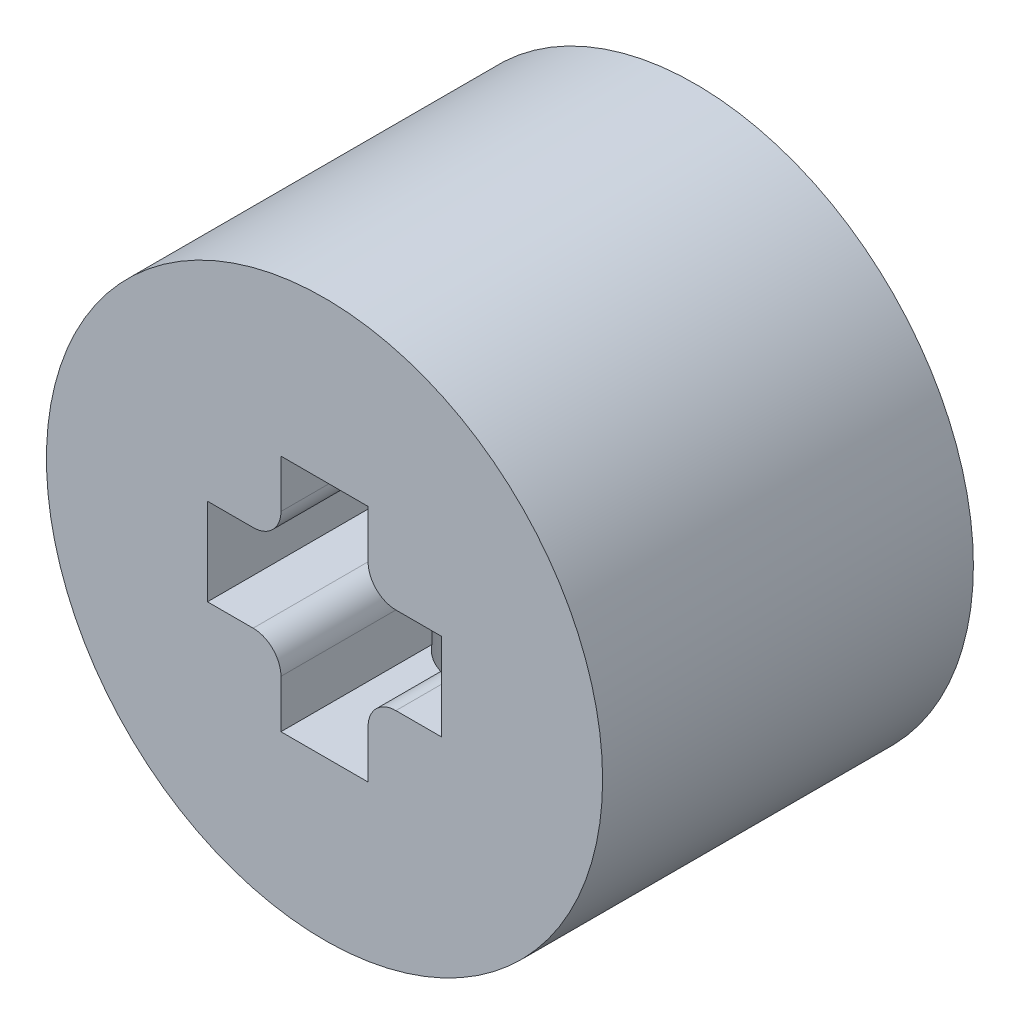
ISO-10303-21;
HEADER;
FILE_DESCRIPTION(('STEP AP214'),'2;1');
FILE_NAME('part.step','',(''),(''),'','','');
FILE_SCHEMA(('AUTOMOTIVE_DESIGN { 1 0 10303 214 1 1 1 1 }'));
ENDSEC;
DATA;
#1=APPLICATION_CONTEXT('core data for automotive mechanical design processes');
#2=APPLICATION_PROTOCOL_DEFINITION('international standard','automotive_design',2000,#1);
#3=PRODUCT_CONTEXT('',#1,'mechanical');
#4=PRODUCT('Part','Part','',(#3));
#5=PRODUCT_RELATED_PRODUCT_CATEGORY('part','',(#4));
#6=PRODUCT_DEFINITION_FORMATION('','',#4);
#7=PRODUCT_DEFINITION_CONTEXT('part definition',#1,'design');
#8=PRODUCT_DEFINITION('design','',#6,#7);
#9=PRODUCT_DEFINITION_SHAPE('','',#8);
#10=(LENGTH_UNIT() NAMED_UNIT(*) SI_UNIT(.MILLI.,.METRE.));
#11=(NAMED_UNIT(*) PLANE_ANGLE_UNIT() SI_UNIT($,.RADIAN.));
#12=(NAMED_UNIT(*) SI_UNIT($,.STERADIAN.) SOLID_ANGLE_UNIT());
#13=UNCERTAINTY_MEASURE_WITH_UNIT(LENGTH_MEASURE(1.E-05),#10,'distance_accuracy_value','');
#14=(GEOMETRIC_REPRESENTATION_CONTEXT(3) GLOBAL_UNCERTAINTY_ASSIGNED_CONTEXT((#13)) GLOBAL_UNIT_ASSIGNED_CONTEXT((#10,
#11,#12)) REPRESENTATION_CONTEXT('',''));
#15=CARTESIAN_POINT('',(0.,0.,0.));
#16=DIRECTION('',(0.,0.,1.));
#17=DIRECTION('',(1.,0.,0.));
#18=AXIS2_PLACEMENT_3D('',#15,#16,#17);
#19=CARTESIAN_POINT('',(0.,0.,8.));
#20=DIRECTION('',(0.,0.,-1.));
#21=DIRECTION('',(-1.,0.,0.));
#22=AXIS2_PLACEMENT_3D('',#19,#20,#21);
#23=CYLINDRICAL_SURFACE('',#22,6.);
#24=CARTESIAN_POINT('',(0.,0.,8.));
#25=DIRECTION('',(0.,0.,1.));
#26=DIRECTION('',(1.,0.,0.));
#27=AXIS2_PLACEMENT_3D('',#24,#25,#26);
#28=CIRCLE('',#27,6.);
#29=CARTESIAN_POINT('',(6.,0.,8.));
#30=VERTEX_POINT('',#29);
#31=EDGE_CURVE('E310',#30,#30,#28,.T.);
#32=ORIENTED_EDGE('',*,*,#31,.F.);
#33=EDGE_LOOP('',(#32));
#34=FACE_BOUND('',#33,.T.);
#35=CARTESIAN_POINT('',(0.,0.,0.));
#36=DIRECTION('',(0.,0.,1.));
#37=DIRECTION('',(1.,0.,0.));
#38=AXIS2_PLACEMENT_3D('',#35,#36,#37);
#39=CIRCLE('',#38,6.);
#40=CARTESIAN_POINT('',(6.,0.,0.));
#41=VERTEX_POINT('',#40);
#42=EDGE_CURVE('E313',#41,#41,#39,.T.);
#43=ORIENTED_EDGE('',*,*,#42,.T.);
#44=EDGE_LOOP('',(#43));
#45=FACE_BOUND('',#44,.T.);
#46=CARTESIAN_POINT('',(0.,-6.,2.8));
#47=CARTESIAN_POINT('',(0.0666922881511598,-5.99999877097045,2.80000245339801));
#48=CARTESIAN_POINT('',(0.133415592241827,-5.99887662213877,2.80557861156118));
#49=CARTESIAN_POINT('',(0.264976209226823,-5.99450838747878,2.82771820013829));
#50=CARTESIAN_POINT('',(0.329811981049627,-5.99126061432223,2.84429035936181));
#51=CARTESIAN_POINT('',(0.455676366315975,-5.98300379133944,2.88788952834495));
#52=CARTESIAN_POINT('',(0.516708561519761,-5.97799642892062,2.91490652421363));
#53=CARTESIAN_POINT('',(0.633369586637071,-5.96676477642377,2.97859869701355));
#54=CARTESIAN_POINT('',(0.688998738090974,-5.96054055882848,3.01527329872865));
#55=CARTESIAN_POINT('',(0.794032172777838,-5.94746598395964,3.09776619314972));
#56=CARTESIAN_POINT('',(0.843352741390229,-5.94060894605217,3.14369002646944));
#57=CARTESIAN_POINT('',(0.933644107929634,-5.92709016543106,3.24315089967004));
#58=CARTESIAN_POINT('',(0.974614253724509,-5.92042843800509,3.29668853360214));
#59=CARTESIAN_POINT('',(1.04739810401714,-5.90798930175138,3.41045943161425));
#60=CARTESIAN_POINT('',(1.07912512663904,-5.90222048837935,3.47074917255563));
#61=CARTESIAN_POINT('',(1.13196679989637,-5.89231521670101,3.59593818280489));
#62=CARTESIAN_POINT('',(1.15308249892469,-5.88817859714354,3.66083699601561));
#63=CARTESIAN_POINT('',(1.18383035986179,-5.88207366302646,3.7925012366895));
#64=CARTESIAN_POINT('',(1.19360939755053,-5.88007764128625,3.85923105297067));
#65=CARTESIAN_POINT('',(1.20186255327134,-5.87839650072753,3.99341178563721));
#66=CARTESIAN_POINT('',(1.2003378272562,-5.87871114561409,4.06086262758417));
#67=CARTESIAN_POINT('',(1.18614548772218,-5.88159061377822,4.1934961456252));
#68=CARTESIAN_POINT('',(1.17364624829269,-5.88412143430516,4.25869768675278));
#69=CARTESIAN_POINT('',(1.13812546154766,-5.89109455392002,4.3860592919956));
#70=CARTESIAN_POINT('',(1.11510341172082,-5.89553694429335,4.44821921070281));
#71=CARTESIAN_POINT('',(1.05902974040966,-5.9058674220049,4.56821831404432));
#72=CARTESIAN_POINT('',(1.02591138147854,-5.91176507776446,4.62602545548301));
#73=CARTESIAN_POINT('',(0.950632289487216,-5.92433542527674,4.73532501996738));
#74=CARTESIAN_POINT('',(0.908470517228195,-5.93100820606039,4.78681671622139));
#75=CARTESIAN_POINT('',(0.815399921472702,-5.94452425489754,4.88299528294832));
#76=CARTESIAN_POINT('',(0.764347393454934,-5.95136843053086,4.92754308143096));
#77=CARTESIAN_POINT('',(0.655422028874412,-5.9643461845729,5.00746461556147));
#78=CARTESIAN_POINT('',(0.597549104855267,-5.97047975386768,5.04283823355229));
#79=CARTESIAN_POINT('',(0.476471264254705,-5.98136028193065,5.10343301107117));
#80=CARTESIAN_POINT('',(0.41325818350236,-5.98610506617926,5.12863827237344));
#81=CARTESIAN_POINT('',(0.283378771738398,-5.9936569078543,5.16803256884628));
#82=CARTESIAN_POINT('',(0.21671286008694,-5.99646420000638,5.18222293848835));
#83=CARTESIAN_POINT('',(0.0830152867525815,-5.99979206240241,5.19898774455313));
#84=CARTESIAN_POINT('',(0.0160083939906924,-6.00035009582964,5.20175250344832));
#85=CARTESIAN_POINT('',(-0.117509921031256,-5.99922062316123,5.19610016926938));
#86=CARTESIAN_POINT('',(-0.184021370932551,-5.99753324329735,5.18768370477688));
#87=CARTESIAN_POINT('',(-0.314046791935848,-5.99212598409621,5.16006595174725));
#88=CARTESIAN_POINT('',(-0.377582338007883,-5.98842451685048,5.14096231780252));
#89=CARTESIAN_POINT('',(-0.5005483529996,-5.97940262473239,5.09261922081303));
#90=CARTESIAN_POINT('',(-0.559978513965047,-5.97408207857072,5.0633789983878));
#91=CARTESIAN_POINT('',(-0.67384940842346,-5.96231893839953,4.99518101121842));
#92=CARTESIAN_POINT('',(-0.728220152102624,-5.95586340524462,4.95610866275327));
#93=CARTESIAN_POINT('',(-0.829701622943047,-5.94257681795859,4.86950897055126));
#94=CARTESIAN_POINT('',(-0.876811570716914,-5.93574572362066,4.82198072032016));
#95=CARTESIAN_POINT('',(-0.963168708929011,-5.92235164268358,4.71895197773065));
#96=CARTESIAN_POINT('',(-1.00228524293839,-5.91579432279965,4.6633411069344));
#97=CARTESIAN_POINT('',(-1.07062250406145,-5.90381030155433,4.54622636637199));
#98=CARTESIAN_POINT('',(-1.09984362710748,-5.89838355496011,4.48472273251174));
#99=CARTESIAN_POINT('',(-1.14738220989835,-5.8893208870126,4.35787810462054));
#100=CARTESIAN_POINT('',(-1.16575619974926,-5.88567569846624,4.29255899054762));
#101=CARTESIAN_POINT('',(-1.19125038195263,-5.8805692415043,4.15967985581092));
#102=CARTESIAN_POINT('',(-1.19837204187013,-5.87910768829334,4.09212012854878));
#103=CARTESIAN_POINT('',(-1.20110509304096,-5.87854979557655,3.95798936254682));
#104=CARTESIAN_POINT('',(-1.19692294568507,-5.87941103027161,3.89142262128759));
#105=CARTESIAN_POINT('',(-1.17762276492007,-5.88330688181537,3.75996202011397));
#106=CARTESIAN_POINT('',(-1.16250481935516,-5.88634148120603,3.69506814676623));
#107=CARTESIAN_POINT('',(-1.12185428219874,-5.8942231706299,3.56892674651135));
#108=CARTESIAN_POINT('',(-1.09634700806081,-5.89906585222597,3.5076707673971));
#109=CARTESIAN_POINT('',(-1.03566557352193,-5.91002057969004,3.39027553511867));
#110=CARTESIAN_POINT('',(-1.00049060252986,-5.91613273198673,3.33413671152984));
#111=CARTESIAN_POINT('',(-0.920767097743697,-5.9290675262787,3.22754131341962));
#112=CARTESIAN_POINT('',(-0.876069464682216,-5.9359004749164,3.17719748167889));
#113=CARTESIAN_POINT('',(-0.778877242815769,-5.94943298246346,3.084656553365));
#114=CARTESIAN_POINT('',(-0.726380864584002,-5.95613251035821,3.04246133161927));
#115=CARTESIAN_POINT('',(-0.614421154905895,-5.96872598865566,2.96699842726426));
#116=CARTESIAN_POINT('',(-0.554890661315801,-5.97461077463096,2.93382879606397));
#117=CARTESIAN_POINT('',(-0.430999633128879,-5.98482150102,2.87801665288409));
#118=CARTESIAN_POINT('',(-0.366643513035751,-5.98914884566339,2.85536465256101));
#119=CARTESIAN_POINT('',(-0.251785786708535,-5.99491647114445,2.82561766234634));
#120=CARTESIAN_POINT('',(-0.201937996816541,-5.99681163790142,2.81602816755069));
#121=CARTESIAN_POINT('',(-0.10139943025208,-5.99935384967871,2.80321850516996));
#122=CARTESIAN_POINT('',(-0.0507086804983428,-6.00000093447786,2.79999813458828));
#123=CARTESIAN_POINT('',(0.,-6.,2.8));
#124=B_SPLINE_CURVE_WITH_KNOTS('',3,(#46,#47,#48,#49,#50,#51,#52,#53,#54,#55,#56,#57,#58,#59,
#60,#61,#62,#63,#64,#65,#66,#67,#68,#69,#70,#71,#72,#73,#74,#75,#76,#77,#78,#79,#80,#81,#82,#83,
#84,#85,#86,#87,#88,#89,#90,#91,#92,#93,#94,#95,#96,#97,#98,#99,#100,#101,#102,#103,#104,#105,
#106,#107,#108,#109,#110,#111,#112,#113,#114,#115,#116,#117,#118,#119,#120,#121,#122,#123),
.UNSPECIFIED.,.T.,.F.,(4,2,2,2,2,2,2,2,2,2,2,2,2,2,2,2,2,2,2,2,2,2,2,2,2,2,2,2,2,2,2,2,2,2,2,2,
2,2,4),(0.,0.19989135679351,0.399941580829587,0.59980048230041,0.799647482677035,
1.00191920413462,1.20420671609684,1.40833434007107,1.61244179238237,1.81387422124305,
2.0152860513747,2.21366072407534,2.41204487104476,2.61176988244311,2.81151785699605,
3.01485902989621,3.21820281047784,3.42186329824829,3.62549910837643,3.82572882811518,
4.02594729189441,4.22436544740868,4.42279847059227,4.6236607924003,4.82454466015116,
5.02848754295071,5.2324222646816,5.43528457239268,5.63812041996498,5.83727667081242,
6.0364313219113,6.23510353503732,6.4337924109824,6.63585691486972,6.83796785439517,
7.04219396010765,7.24623546621022,7.39822530347873,7.55021029645196),.UNSPECIFIED.);
#125=CARTESIAN_POINT('',(0.,-6.,2.8));
#126=VERTEX_POINT('',#125);
#127=EDGE_CURVE('E236',#126,#126,#124,.T.);
#128=ORIENTED_EDGE('',*,*,#127,.F.);
#129=EDGE_LOOP('',(#128));
#130=FACE_BOUND('',#129,.T.);
#131=ADVANCED_FACE('F69',(#34,#45,#130),#23,.T.);
#132=CARTESIAN_POINT('',(0.939999999999999,2.575,0.));
#133=DIRECTION('',(-1.,0.,0.));
#134=DIRECTION('',(0.,-1.,0.));
#135=AXIS2_PLACEMENT_3D('',#132,#133,#134);
#136=PLANE('',#135);
#137=DIRECTION('',(0.,0.,1.));
#138=VECTOR('',#137,1.);
#139=CARTESIAN_POINT('',(0.94,-2.575,0.));
#140=LINE('',#139,#138);
#141=CARTESIAN_POINT('',(0.94,-2.575,0.));
#142=VERTEX_POINT('',#141);
#143=CARTESIAN_POINT('',(0.94,-2.575,3.25407775204114));
#144=VERTEX_POINT('',#143);
#145=EDGE_CURVE('E403',#142,#144,#140,.T.);
#146=ORIENTED_EDGE('',*,*,#145,.T.);
#147=DIRECTION('',(0.,-1.,0.));
#148=VECTOR('',#147,1.);
#149=CARTESIAN_POINT('',(0.94,-2.075,3.25407775204114));
#150=LINE('',#149,#148);
#151=CARTESIAN_POINT('',(0.94,-2.075,3.25407775204114));
#152=VERTEX_POINT('',#151);
#153=EDGE_CURVE('E228',#144,#152,#150,.F.);
#154=ORIENTED_EDGE('',*,*,#153,.T.);
#155=DIRECTION('',(0.,0.,-1.));
#156=VECTOR('',#155,1.);
#157=CARTESIAN_POINT('',(0.94,-2.075,0.));
#158=LINE('',#157,#156);
#159=CARTESIAN_POINT('',(0.94,-2.075,4.74592224795886));
#160=VERTEX_POINT('',#159);
#161=EDGE_CURVE('E223',#160,#152,#158,.T.);
#162=ORIENTED_EDGE('',*,*,#161,.F.);
#163=DIRECTION('',(0.,-1.,0.));
#164=VECTOR('',#163,1.);
#165=CARTESIAN_POINT('',(0.94,-2.075,4.74592224795886));
#166=LINE('',#165,#164);
#167=CARTESIAN_POINT('',(0.94,-2.575,4.74592224795886));
#168=VERTEX_POINT('',#167);
#169=EDGE_CURVE('E207',#160,#168,#166,.T.);
#170=ORIENTED_EDGE('',*,*,#169,.T.);
#171=CARTESIAN_POINT('',(0.94,-2.575,8.));
#172=VERTEX_POINT('',#171);
#173=EDGE_CURVE('E386',#168,#172,#140,.T.);
#174=ORIENTED_EDGE('',*,*,#173,.T.);
#175=DIRECTION('',(0.,-1.,0.));
#176=VECTOR('',#175,1.);
#177=CARTESIAN_POINT('',(0.939999999999999,2.575,8.));
#178=LINE('',#177,#176);
#179=CARTESIAN_POINT('',(0.94,-1.54,8.));
#180=VERTEX_POINT('',#179);
#181=EDGE_CURVE('E463',#180,#172,#178,.T.);
#182=ORIENTED_EDGE('',*,*,#181,.F.);
#183=DIRECTION('',(0.,0.,-1.));
#184=VECTOR('',#183,1.);
#185=CARTESIAN_POINT('',(0.94,-1.54,0.));
#186=LINE('',#185,#184);
#187=CARTESIAN_POINT('',(0.94,-1.54,0.));
#188=VERTEX_POINT('',#187);
#189=EDGE_CURVE('E363',#180,#188,#186,.T.);
#190=ORIENTED_EDGE('',*,*,#189,.T.);
#191=DIRECTION('',(0.,-1.,0.));
#192=VECTOR('',#191,1.);
#193=CARTESIAN_POINT('',(0.939999999999999,2.575,0.));
#194=LINE('',#193,#192);
#195=EDGE_CURVE('E448',#188,#142,#194,.T.);
#196=ORIENTED_EDGE('',*,*,#195,.T.);
#197=EDGE_LOOP('',(#146,#154,#162,#170,#174,#182,#190,#196));
#198=FACE_BOUND('',#197,.T.);
#199=ADVANCED_FACE('F227',(#198),#136,.T.);
#200=CARTESIAN_POINT('',(-0.94,-2.575,0.));
#201=DIRECTION('',(0.,-1.,0.));
#202=DIRECTION('',(0.,0.,-1.));
#203=AXIS2_PLACEMENT_3D('',#200,#201,#202);
#204=PLANE('',#203);
#205=CARTESIAN_POINT('',(0.,-2.575,4.));
#206=DIRECTION('',(0.,-1.,0.));
#207=DIRECTION('',(0.,0.,-1.));
#208=AXIS2_PLACEMENT_3D('',#205,#206,#207);
#209=CIRCLE('',#208,1.2);
#210=CARTESIAN_POINT('',(-0.94,-2.575,4.74592224795886));
#211=VERTEX_POINT('',#210);
#212=EDGE_CURVE('E214',#211,#168,#209,.F.);
#213=ORIENTED_EDGE('',*,*,#212,.F.);
#214=DIRECTION('',(0.,0.,1.));
#215=VECTOR('',#214,1.);
#216=CARTESIAN_POINT('',(-0.94,-2.575,0.));
#217=LINE('',#216,#215);
#218=CARTESIAN_POINT('',(-0.94,-2.575,8.));
#219=VERTEX_POINT('',#218);
#220=EDGE_CURVE('E384',#211,#219,#217,.T.);
#221=ORIENTED_EDGE('',*,*,#220,.T.);
#222=DIRECTION('',(1.,0.,0.));
#223=VECTOR('',#222,1.);
#224=CARTESIAN_POINT('',(-0.94,-2.575,8.));
#225=LINE('',#224,#223);
#226=EDGE_CURVE('E467',#219,#172,#225,.T.);
#227=ORIENTED_EDGE('',*,*,#226,.T.);
#228=ORIENTED_EDGE('',*,*,#173,.F.);
#229=EDGE_LOOP('',(#213,#221,#227,#228));
#230=FACE_BOUND('',#229,.T.);
#231=ADVANCED_FACE('F279',(#230),#204,.F.);
#232=CARTESIAN_POINT('',(-0.940000000000001,2.575,0.));
#233=DIRECTION('',(-1.,0.,0.));
#234=DIRECTION('',(0.,-1.,0.));
#235=AXIS2_PLACEMENT_3D('',#232,#233,#234);
#236=PLANE('',#235);
#237=DIRECTION('',(0.,-1.,0.));
#238=VECTOR('',#237,1.);
#239=CARTESIAN_POINT('',(-0.94,-2.075,3.25407775204114));
#240=LINE('',#239,#238);
#241=CARTESIAN_POINT('',(-0.94,-2.575,3.25407775204114));
#242=VERTEX_POINT('',#241);
#243=CARTESIAN_POINT('',(-0.94,-2.075,3.25407775204114));
#244=VERTEX_POINT('',#243);
#245=EDGE_CURVE('E12',#242,#244,#240,.F.);
#246=ORIENTED_EDGE('',*,*,#245,.F.);
#247=CARTESIAN_POINT('',(-0.94,-2.575,0.));
#248=VERTEX_POINT('',#247);
#249=EDGE_CURVE('E392',#248,#242,#217,.T.);
#250=ORIENTED_EDGE('',*,*,#249,.F.);
#251=DIRECTION('',(0.,-1.,0.));
#252=VECTOR('',#251,1.);
#253=CARTESIAN_POINT('',(-0.940000000000001,2.575,0.));
#254=LINE('',#253,#252);
#255=CARTESIAN_POINT('',(-0.94,-1.54,0.));
#256=VERTEX_POINT('',#255);
#257=EDGE_CURVE('E457',#256,#248,#254,.T.);
#258=ORIENTED_EDGE('',*,*,#257,.F.);
#259=DIRECTION('',(0.,0.,-1.));
#260=VECTOR('',#259,1.);
#261=CARTESIAN_POINT('',(-0.94,-1.54,0.));
#262=LINE('',#261,#260);
#263=CARTESIAN_POINT('',(-0.94,-1.54,8.));
#264=VERTEX_POINT('',#263);
#265=EDGE_CURVE('E360',#256,#264,#262,.F.);
#266=ORIENTED_EDGE('',*,*,#265,.T.);
#267=DIRECTION('',(0.,-1.,0.));
#268=VECTOR('',#267,1.);
#269=CARTESIAN_POINT('',(-0.940000000000001,2.575,8.));
#270=LINE('',#269,#268);
#271=EDGE_CURVE('E389',#264,#219,#270,.T.);
#272=ORIENTED_EDGE('',*,*,#271,.T.);
#273=ORIENTED_EDGE('',*,*,#220,.F.);
#274=DIRECTION('',(0.,-1.,0.));
#275=VECTOR('',#274,1.);
#276=CARTESIAN_POINT('',(-0.94,-2.075,4.74592224795886));
#277=LINE('',#276,#275);
#278=CARTESIAN_POINT('',(-0.94,-2.075,4.74592224795886));
#279=VERTEX_POINT('',#278);
#280=EDGE_CURVE('E78',#279,#211,#277,.T.);
#281=ORIENTED_EDGE('',*,*,#280,.F.);
#282=DIRECTION('',(0.,0.,-1.));
#283=VECTOR('',#282,1.);
#284=CARTESIAN_POINT('',(-0.94,-2.075,0.));
#285=LINE('',#284,#283);
#286=EDGE_CURVE('E376',#279,#244,#285,.T.);
#287=ORIENTED_EDGE('',*,*,#286,.T.);
#288=EDGE_LOOP('',(#246,#250,#258,#266,#272,#273,#281,#287));
#289=FACE_BOUND('',#288,.T.);
#290=ADVANCED_FACE('F275',(#289),#236,.F.);
#291=CARTESIAN_POINT('',(0.,0.,8.));
#292=DIRECTION('',(0.,0.,1.));
#293=DIRECTION('',(1.,0.,0.));
#294=AXIS2_PLACEMENT_3D('',#291,#292,#293);
#295=PLANE('',#294);
#296=ORIENTED_EDGE('',*,*,#31,.T.);
#297=EDGE_LOOP('',(#296));
#298=FACE_BOUND('',#297,.T.);
#299=DIRECTION('',(1.,0.,0.));
#300=VECTOR('',#299,1.);
#301=CARTESIAN_POINT('',(-2.525,0.94,8.));
#302=LINE('',#301,#300);
#303=CARTESIAN_POINT('',(-2.525,0.94,8.));
#304=VERTEX_POINT('',#303);
#305=CARTESIAN_POINT('',(-1.54,0.94,8.));
#306=VERTEX_POINT('',#305);
#307=EDGE_CURVE('E431',#304,#306,#302,.T.);
#308=ORIENTED_EDGE('',*,*,#307,.T.);
#309=CARTESIAN_POINT('',(-1.54,1.54,8.));
#310=DIRECTION('',(0.,0.,1.));
#311=DIRECTION('',(1.,0.,0.));
#312=AXIS2_PLACEMENT_3D('',#309,#310,#311);
#313=CIRCLE('',#312,0.6);
#314=CARTESIAN_POINT('',(-0.94,1.54,8.));
#315=VERTEX_POINT('',#314);
#316=EDGE_CURVE('E353',#306,#315,#313,.T.);
#317=ORIENTED_EDGE('',*,*,#316,.T.);
#318=CARTESIAN_POINT('',(-0.940000000000001,2.575,8.));
#319=VERTEX_POINT('',#318);
#320=EDGE_CURVE('E449',#319,#315,#270,.T.);
#321=ORIENTED_EDGE('',*,*,#320,.F.);
#322=DIRECTION('',(1.,0.,0.));
#323=VECTOR('',#322,1.);
#324=CARTESIAN_POINT('',(-0.940000000000001,2.575,8.));
#325=LINE('',#324,#323);
#326=CARTESIAN_POINT('',(0.939999999999999,2.575,8.));
#327=VERTEX_POINT('',#326);
#328=EDGE_CURVE('E245',#319,#327,#325,.T.);
#329=ORIENTED_EDGE('',*,*,#328,.T.);
#330=CARTESIAN_POINT('',(0.94,1.54,8.));
#331=VERTEX_POINT('',#330);
#332=EDGE_CURVE('E464',#327,#331,#178,.T.);
#333=ORIENTED_EDGE('',*,*,#332,.T.);
#334=CARTESIAN_POINT('',(1.54,1.54,8.));
#335=DIRECTION('',(0.,0.,1.));
#336=DIRECTION('',(1.,0.,0.));
#337=AXIS2_PLACEMENT_3D('',#334,#335,#336);
#338=CIRCLE('',#337,0.6);
#339=CARTESIAN_POINT('',(1.54,0.94,8.));
#340=VERTEX_POINT('',#339);
#341=EDGE_CURVE('E344',#331,#340,#338,.T.);
#342=ORIENTED_EDGE('',*,*,#341,.T.);
#343=CARTESIAN_POINT('',(2.525,0.94,8.));
#344=VERTEX_POINT('',#343);
#345=EDGE_CURVE('E430',#340,#344,#302,.T.);
#346=ORIENTED_EDGE('',*,*,#345,.T.);
#347=DIRECTION('',(0.,-1.,0.));
#348=VECTOR('',#347,1.);
#349=CARTESIAN_POINT('',(2.525,0.94,8.));
#350=LINE('',#349,#348);
#351=CARTESIAN_POINT('',(2.525,-0.94,8.));
#352=VERTEX_POINT('',#351);
#353=EDGE_CURVE('E426',#344,#352,#350,.T.);
#354=ORIENTED_EDGE('',*,*,#353,.T.);
#355=DIRECTION('',(1.,0.,0.));
#356=VECTOR('',#355,1.);
#357=CARTESIAN_POINT('',(-2.525,-0.94,8.));
#358=LINE('',#357,#356);
#359=CARTESIAN_POINT('',(1.54,-0.94,8.));
#360=VERTEX_POINT('',#359);
#361=EDGE_CURVE('E413',#360,#352,#358,.T.);
#362=ORIENTED_EDGE('',*,*,#361,.F.);
#363=CARTESIAN_POINT('',(1.54,-1.54,8.));
#364=DIRECTION('',(0.,0.,1.));
#365=DIRECTION('',(1.,0.,0.));
#366=AXIS2_PLACEMENT_3D('',#363,#364,#365);
#367=CIRCLE('',#366,0.6);
#368=EDGE_CURVE('E347',#360,#180,#367,.T.);
#369=ORIENTED_EDGE('',*,*,#368,.T.);
#370=ORIENTED_EDGE('',*,*,#181,.T.);
#371=ORIENTED_EDGE('',*,*,#226,.F.);
#372=ORIENTED_EDGE('',*,*,#271,.F.);
#373=CARTESIAN_POINT('',(-1.54,-1.54,8.));
#374=DIRECTION('',(0.,0.,1.));
#375=DIRECTION('',(1.,0.,0.));
#376=AXIS2_PLACEMENT_3D('',#373,#374,#375);
#377=CIRCLE('',#376,0.6);
#378=CARTESIAN_POINT('',(-1.54,-0.94,8.));
#379=VERTEX_POINT('',#378);
#380=EDGE_CURVE('E350',#264,#379,#377,.T.);
#381=ORIENTED_EDGE('',*,*,#380,.T.);
#382=CARTESIAN_POINT('',(-2.525,-0.94,8.));
#383=VERTEX_POINT('',#382);
#384=EDGE_CURVE('E418',#383,#379,#358,.T.);
#385=ORIENTED_EDGE('',*,*,#384,.F.);
#386=DIRECTION('',(0.,-1.,0.));
#387=VECTOR('',#386,1.);
#388=CARTESIAN_POINT('',(-2.525,0.94,8.));
#389=LINE('',#388,#387);
#390=EDGE_CURVE('E408',#304,#383,#389,.T.);
#391=ORIENTED_EDGE('',*,*,#390,.F.);
#392=EDGE_LOOP('',(#308,#317,#321,#329,#333,#342,#346,#354,#362,#369,#370,#371,#372,#381,#385,#391));
#393=FACE_BOUND('',#392,.T.);
#394=ADVANCED_FACE('F278',(#298,#393),#295,.T.);
#395=CARTESIAN_POINT('',(0.,0.,0.));
#396=DIRECTION('',(0.,0.,1.));
#397=DIRECTION('',(1.,0.,0.));
#398=AXIS2_PLACEMENT_3D('',#395,#396,#397);
#399=PLANE('',#398);
#400=ORIENTED_EDGE('',*,*,#42,.F.);
#401=EDGE_LOOP('',(#400));
#402=FACE_BOUND('',#401,.T.);
#403=CARTESIAN_POINT('',(-0.940000000000001,2.575,0.));
#404=VERTEX_POINT('',#403);
#405=CARTESIAN_POINT('',(-0.94,1.54,0.));
#406=VERTEX_POINT('',#405);
#407=EDGE_CURVE('E399',#404,#406,#254,.T.);
#408=ORIENTED_EDGE('',*,*,#407,.T.);
#409=CARTESIAN_POINT('',(-1.54,1.54,0.));
#410=DIRECTION('',(0.,0.,1.));
#411=DIRECTION('',(1.,0.,0.));
#412=AXIS2_PLACEMENT_3D('',#409,#410,#411);
#413=CIRCLE('',#412,0.6);
#414=CARTESIAN_POINT('',(-1.54,0.94,0.));
#415=VERTEX_POINT('',#414);
#416=EDGE_CURVE('E338',#406,#415,#413,.F.);
#417=ORIENTED_EDGE('',*,*,#416,.T.);
#418=DIRECTION('',(1.,0.,0.));
#419=VECTOR('',#418,1.);
#420=CARTESIAN_POINT('',(-2.525,0.94,0.));
#421=LINE('',#420,#419);
#422=CARTESIAN_POINT('',(-2.525,0.94,0.));
#423=VERTEX_POINT('',#422);
#424=EDGE_CURVE('E421',#423,#415,#421,.T.);
#425=ORIENTED_EDGE('',*,*,#424,.F.);
#426=DIRECTION('',(0.,-1.,0.));
#427=VECTOR('',#426,1.);
#428=CARTESIAN_POINT('',(-2.525,0.94,0.));
#429=LINE('',#428,#427);
#430=CARTESIAN_POINT('',(-2.525,-0.94,0.));
#431=VERTEX_POINT('',#430);
#432=EDGE_CURVE('E246',#423,#431,#429,.T.);
#433=ORIENTED_EDGE('',*,*,#432,.T.);
#434=DIRECTION('',(1.,0.,0.));
#435=VECTOR('',#434,1.);
#436=CARTESIAN_POINT('',(-2.525,-0.94,0.));
#437=LINE('',#436,#435);
#438=CARTESIAN_POINT('',(-1.54,-0.94,0.));
#439=VERTEX_POINT('',#438);
#440=EDGE_CURVE('E502',#431,#439,#437,.T.);
#441=ORIENTED_EDGE('',*,*,#440,.T.);
#442=CARTESIAN_POINT('',(-1.54,-1.54,0.));
#443=DIRECTION('',(0.,0.,1.));
#444=DIRECTION('',(1.,0.,0.));
#445=AXIS2_PLACEMENT_3D('',#442,#443,#444);
#446=CIRCLE('',#445,0.6);
#447=EDGE_CURVE('E335',#439,#256,#446,.F.);
#448=ORIENTED_EDGE('',*,*,#447,.T.);
#449=ORIENTED_EDGE('',*,*,#257,.T.);
#450=DIRECTION('',(1.,0.,0.));
#451=VECTOR('',#450,1.);
#452=CARTESIAN_POINT('',(-0.94,-2.575,0.));
#453=LINE('',#452,#451);
#454=EDGE_CURVE('E453',#248,#142,#453,.T.);
#455=ORIENTED_EDGE('',*,*,#454,.T.);
#456=ORIENTED_EDGE('',*,*,#195,.F.);
#457=CARTESIAN_POINT('',(1.54,-1.54,0.));
#458=DIRECTION('',(0.,0.,1.));
#459=DIRECTION('',(1.,0.,0.));
#460=AXIS2_PLACEMENT_3D('',#457,#458,#459);
#461=CIRCLE('',#460,0.6);
#462=CARTESIAN_POINT('',(1.54,-0.94,0.));
#463=VERTEX_POINT('',#462);
#464=EDGE_CURVE('E332',#188,#463,#461,.F.);
#465=ORIENTED_EDGE('',*,*,#464,.T.);
#466=CARTESIAN_POINT('',(2.525,-0.94,0.));
#467=VERTEX_POINT('',#466);
#468=EDGE_CURVE('E496',#463,#467,#437,.T.);
#469=ORIENTED_EDGE('',*,*,#468,.T.);
#470=DIRECTION('',(0.,-1.,0.));
#471=VECTOR('',#470,1.);
#472=CARTESIAN_POINT('',(2.525,0.94,0.));
#473=LINE('',#472,#471);
#474=CARTESIAN_POINT('',(2.525,0.94,0.));
#475=VERTEX_POINT('',#474);
#476=EDGE_CURVE('E505',#475,#467,#473,.T.);
#477=ORIENTED_EDGE('',*,*,#476,.F.);
#478=CARTESIAN_POINT('',(1.54,0.94,0.));
#479=VERTEX_POINT('',#478);
#480=EDGE_CURVE('E508',#479,#475,#421,.T.);
#481=ORIENTED_EDGE('',*,*,#480,.F.);
#482=CARTESIAN_POINT('',(1.54,1.54,0.));
#483=DIRECTION('',(0.,0.,1.));
#484=DIRECTION('',(1.,0.,0.));
#485=AXIS2_PLACEMENT_3D('',#482,#483,#484);
#486=CIRCLE('',#485,0.6);
#487=CARTESIAN_POINT('',(0.94,1.54,0.));
#488=VERTEX_POINT('',#487);
#489=EDGE_CURVE('E329',#479,#488,#486,.F.);
#490=ORIENTED_EDGE('',*,*,#489,.T.);
#491=CARTESIAN_POINT('',(0.939999999999999,2.575,0.));
#492=VERTEX_POINT('',#491);
#493=EDGE_CURVE('E450',#492,#488,#194,.T.);
#494=ORIENTED_EDGE('',*,*,#493,.F.);
#495=DIRECTION('',(1.,0.,0.));
#496=VECTOR('',#495,1.);
#497=CARTESIAN_POINT('',(-0.940000000000001,2.575,0.));
#498=LINE('',#497,#496);
#499=EDGE_CURVE('E445',#404,#492,#498,.T.);
#500=ORIENTED_EDGE('',*,*,#499,.F.);
#501=EDGE_LOOP('',(#408,#417,#425,#433,#441,#448,#449,#455,#456,#465,#469,#477,#481,#490,#494,#500));
#502=FACE_BOUND('',#501,.T.);
#503=ADVANCED_FACE('F270',(#402,#502),#399,.F.);
#504=CARTESIAN_POINT('',(-2.525,-0.94,0.));
#505=DIRECTION('',(0.,-1.,0.));
#506=DIRECTION('',(0.,0.,-1.));
#507=AXIS2_PLACEMENT_3D('',#504,#505,#506);
#508=PLANE('',#507);
#509=ORIENTED_EDGE('',*,*,#384,.T.);
#510=DIRECTION('',(0.,0.,-1.));
#511=VECTOR('',#510,1.);
#512=CARTESIAN_POINT('',(-1.54,-0.94,0.));
#513=LINE('',#512,#511);
#514=EDGE_CURVE('E356',#379,#439,#513,.T.);
#515=ORIENTED_EDGE('',*,*,#514,.T.);
#516=ORIENTED_EDGE('',*,*,#440,.F.);
#517=DIRECTION('',(0.,0.,1.));
#518=VECTOR('',#517,1.);
#519=CARTESIAN_POINT('',(-2.525,-0.94,0.));
#520=LINE('',#519,#518);
#521=EDGE_CURVE('E442',#431,#383,#520,.T.);
#522=ORIENTED_EDGE('',*,*,#521,.T.);
#523=EDGE_LOOP('',(#509,#515,#516,#522));
#524=FACE_BOUND('',#523,.T.);
#525=ADVANCED_FACE('F267',(#524),#508,.F.);
#526=CARTESIAN_POINT('',(-2.525,0.94,0.));
#527=DIRECTION('',(-1.,0.,0.));
#528=DIRECTION('',(0.,0.,1.));
#529=AXIS2_PLACEMENT_3D('',#526,#527,#528);
#530=PLANE('',#529);
#531=ORIENTED_EDGE('',*,*,#390,.T.);
#532=ORIENTED_EDGE('',*,*,#521,.F.);
#533=ORIENTED_EDGE('',*,*,#432,.F.);
#534=DIRECTION('',(0.,0.,1.));
#535=VECTOR('',#534,1.);
#536=CARTESIAN_POINT('',(-2.525,0.94,0.));
#537=LINE('',#536,#535);
#538=EDGE_CURVE('E316',#423,#304,#537,.T.);
#539=ORIENTED_EDGE('',*,*,#538,.T.);
#540=EDGE_LOOP('',(#531,#532,#533,#539));
#541=FACE_BOUND('',#540,.T.);
#542=ADVANCED_FACE('F260',(#541),#530,.F.);
#543=CARTESIAN_POINT('',(-2.525,0.94,0.));
#544=DIRECTION('',(0.,-1.,0.));
#545=DIRECTION('',(0.,0.,-1.));
#546=AXIS2_PLACEMENT_3D('',#543,#544,#545);
#547=PLANE('',#546);
#548=ORIENTED_EDGE('',*,*,#424,.T.);
#549=DIRECTION('',(0.,0.,-1.));
#550=VECTOR('',#549,1.);
#551=CARTESIAN_POINT('',(-1.54,0.94,8.));
#552=LINE('',#551,#550);
#553=EDGE_CURVE('E341',#415,#306,#552,.F.);
#554=ORIENTED_EDGE('',*,*,#553,.T.);
#555=ORIENTED_EDGE('',*,*,#307,.F.);
#556=ORIENTED_EDGE('',*,*,#538,.F.);
#557=EDGE_LOOP('',(#548,#554,#555,#556));
#558=FACE_BOUND('',#557,.T.);
#559=ADVANCED_FACE('F256',(#558),#547,.T.);
#560=CARTESIAN_POINT('',(2.525,0.94,0.));
#561=DIRECTION('',(-1.,0.,0.));
#562=DIRECTION('',(0.,-1.,0.));
#563=AXIS2_PLACEMENT_3D('',#560,#561,#562);
#564=PLANE('',#563);
#565=ORIENTED_EDGE('',*,*,#353,.F.);
#566=DIRECTION('',(0.,0.,1.));
#567=VECTOR('',#566,1.);
#568=CARTESIAN_POINT('',(2.525,0.94,0.));
#569=LINE('',#568,#567);
#570=EDGE_CURVE('E322',#475,#344,#569,.T.);
#571=ORIENTED_EDGE('',*,*,#570,.F.);
#572=ORIENTED_EDGE('',*,*,#476,.T.);
#573=DIRECTION('',(0.,0.,1.));
#574=VECTOR('',#573,1.);
#575=CARTESIAN_POINT('',(2.525,-0.94,0.));
#576=LINE('',#575,#574);
#577=EDGE_CURVE('E438',#467,#352,#576,.T.);
#578=ORIENTED_EDGE('',*,*,#577,.T.);
#579=EDGE_LOOP('',(#565,#571,#572,#578));
#580=FACE_BOUND('',#579,.T.);
#581=ADVANCED_FACE('F259',(#580),#564,.T.);
#582=ORIENTED_EDGE('',*,*,#468,.F.);
#583=DIRECTION('',(0.,0.,-1.));
#584=VECTOR('',#583,1.);
#585=CARTESIAN_POINT('',(1.54,-0.94,8.));
#586=LINE('',#585,#584);
#587=EDGE_CURVE('E367',#463,#360,#586,.F.);
#588=ORIENTED_EDGE('',*,*,#587,.T.);
#589=ORIENTED_EDGE('',*,*,#361,.T.);
#590=ORIENTED_EDGE('',*,*,#577,.F.);
#591=EDGE_LOOP('',(#582,#588,#589,#590));
#592=FACE_BOUND('',#591,.T.);
#593=ADVANCED_FACE('F265',(#592),#508,.F.);
#594=ORIENTED_EDGE('',*,*,#345,.F.);
#595=DIRECTION('',(0.,0.,-1.));
#596=VECTOR('',#595,1.);
#597=CARTESIAN_POINT('',(1.54,0.94,0.));
#598=LINE('',#597,#596);
#599=EDGE_CURVE('E370',#340,#479,#598,.T.);
#600=ORIENTED_EDGE('',*,*,#599,.T.);
#601=ORIENTED_EDGE('',*,*,#480,.T.);
#602=ORIENTED_EDGE('',*,*,#570,.T.);
#603=EDGE_LOOP('',(#594,#600,#601,#602));
#604=FACE_BOUND('',#603,.T.);
#605=ADVANCED_FACE('F262',(#604),#547,.T.);
#606=EDGE_CURVE('E219',#144,#242,#209,.F.);
#607=ORIENTED_EDGE('',*,*,#606,.F.);
#608=ORIENTED_EDGE('',*,*,#145,.F.);
#609=ORIENTED_EDGE('',*,*,#454,.F.);
#610=ORIENTED_EDGE('',*,*,#249,.T.);
#611=EDGE_LOOP('',(#607,#608,#609,#610));
#612=FACE_BOUND('',#611,.T.);
#613=ADVANCED_FACE('F282',(#612),#204,.F.);
#614=CARTESIAN_POINT('',(-0.940000000000001,2.575,0.));
#615=DIRECTION('',(0.,-1.,0.));
#616=DIRECTION('',(0.,0.,-1.));
#617=AXIS2_PLACEMENT_3D('',#614,#615,#616);
#618=PLANE('',#617);
#619=ORIENTED_EDGE('',*,*,#328,.F.);
#620=DIRECTION('',(0.,0.,1.));
#621=VECTOR('',#620,1.);
#622=CARTESIAN_POINT('',(-0.940000000000001,2.575,0.));
#623=LINE('',#622,#621);
#624=EDGE_CURVE('E393',#404,#319,#623,.T.);
#625=ORIENTED_EDGE('',*,*,#624,.F.);
#626=ORIENTED_EDGE('',*,*,#499,.T.);
#627=DIRECTION('',(0.,0.,1.));
#628=VECTOR('',#627,1.);
#629=CARTESIAN_POINT('',(0.939999999999999,2.575,0.));
#630=LINE('',#629,#628);
#631=EDGE_CURVE('E405',#492,#327,#630,.T.);
#632=ORIENTED_EDGE('',*,*,#631,.T.);
#633=EDGE_LOOP('',(#619,#625,#626,#632));
#634=FACE_BOUND('',#633,.T.);
#635=ADVANCED_FACE('F285',(#634),#618,.T.);
#636=ORIENTED_EDGE('',*,*,#493,.T.);
#637=DIRECTION('',(0.,0.,-1.));
#638=VECTOR('',#637,1.);
#639=CARTESIAN_POINT('',(0.94,1.54,0.));
#640=LINE('',#639,#638);
#641=EDGE_CURVE('E91',#488,#331,#640,.F.);
#642=ORIENTED_EDGE('',*,*,#641,.T.);
#643=ORIENTED_EDGE('',*,*,#332,.F.);
#644=ORIENTED_EDGE('',*,*,#631,.F.);
#645=EDGE_LOOP('',(#636,#642,#643,#644));
#646=FACE_BOUND('',#645,.T.);
#647=ADVANCED_FACE('F287',(#646),#136,.T.);
#648=ORIENTED_EDGE('',*,*,#320,.T.);
#649=DIRECTION('',(0.,0.,-1.));
#650=VECTOR('',#649,1.);
#651=CARTESIAN_POINT('',(-0.94,1.54,0.));
#652=LINE('',#651,#650);
#653=EDGE_CURVE('E320',#315,#406,#652,.T.);
#654=ORIENTED_EDGE('',*,*,#653,.T.);
#655=ORIENTED_EDGE('',*,*,#407,.F.);
#656=ORIENTED_EDGE('',*,*,#624,.T.);
#657=EDGE_LOOP('',(#648,#654,#655,#656));
#658=FACE_BOUND('',#657,.T.);
#659=ADVANCED_FACE('F281',(#658),#236,.F.);
#660=CARTESIAN_POINT('',(-1.54,1.54,0.));
#661=DIRECTION('',(0.,0.,1.));
#662=DIRECTION('',(1.,0.,0.));
#663=AXIS2_PLACEMENT_3D('',#660,#661,#662);
#664=CYLINDRICAL_SURFACE('',#663,0.6);
#665=ORIENTED_EDGE('',*,*,#316,.F.);
#666=ORIENTED_EDGE('',*,*,#553,.F.);
#667=ORIENTED_EDGE('',*,*,#416,.F.);
#668=ORIENTED_EDGE('',*,*,#653,.F.);
#669=EDGE_LOOP('',(#665,#666,#667,#668));
#670=FACE_BOUND('',#669,.T.);
#671=ADVANCED_FACE('F293',(#670),#664,.T.);
#672=CARTESIAN_POINT('',(-1.54,-1.54,0.));
#673=DIRECTION('',(0.,0.,-1.));
#674=DIRECTION('',(-1.,0.,0.));
#675=AXIS2_PLACEMENT_3D('',#672,#673,#674);
#676=CYLINDRICAL_SURFACE('',#675,0.6);
#677=ORIENTED_EDGE('',*,*,#380,.F.);
#678=ORIENTED_EDGE('',*,*,#265,.F.);
#679=ORIENTED_EDGE('',*,*,#447,.F.);
#680=ORIENTED_EDGE('',*,*,#514,.F.);
#681=EDGE_LOOP('',(#677,#678,#679,#680));
#682=FACE_BOUND('',#681,.T.);
#683=ADVANCED_FACE('F526',(#682),#676,.T.);
#684=CARTESIAN_POINT('',(1.54,-1.54,0.));
#685=DIRECTION('',(0.,0.,1.));
#686=DIRECTION('',(1.,0.,0.));
#687=AXIS2_PLACEMENT_3D('',#684,#685,#686);
#688=CYLINDRICAL_SURFACE('',#687,0.6);
#689=ORIENTED_EDGE('',*,*,#368,.F.);
#690=ORIENTED_EDGE('',*,*,#587,.F.);
#691=ORIENTED_EDGE('',*,*,#464,.F.);
#692=ORIENTED_EDGE('',*,*,#189,.F.);
#693=EDGE_LOOP('',(#689,#690,#691,#692));
#694=FACE_BOUND('',#693,.T.);
#695=ADVANCED_FACE('F492',(#694),#688,.T.);
#696=CARTESIAN_POINT('',(1.54,1.54,0.));
#697=DIRECTION('',(0.,0.,-1.));
#698=DIRECTION('',(-1.,0.,0.));
#699=AXIS2_PLACEMENT_3D('',#696,#697,#698);
#700=CYLINDRICAL_SURFACE('',#699,0.6);
#701=ORIENTED_EDGE('',*,*,#341,.F.);
#702=ORIENTED_EDGE('',*,*,#641,.F.);
#703=ORIENTED_EDGE('',*,*,#489,.F.);
#704=ORIENTED_EDGE('',*,*,#599,.F.);
#705=EDGE_LOOP('',(#701,#702,#703,#704));
#706=FACE_BOUND('',#705,.T.);
#707=ADVANCED_FACE('F71',(#706),#700,.T.);
#708=CARTESIAN_POINT('',(0.,-2.075,4.));
#709=DIRECTION('',(0.,-1.,0.));
#710=DIRECTION('',(0.,0.,-1.));
#711=AXIS2_PLACEMENT_3D('',#708,#709,#710);
#712=CYLINDRICAL_SURFACE('',#711,1.2);
#713=ORIENTED_EDGE('',*,*,#606,.T.);
#714=ORIENTED_EDGE('',*,*,#245,.T.);
#715=CARTESIAN_POINT('',(0.,-2.075,4.));
#716=DIRECTION('',(0.,1.,0.));
#717=DIRECTION('',(0.,0.,1.));
#718=AXIS2_PLACEMENT_3D('',#715,#716,#717);
#719=CIRCLE('',#718,1.2);
#720=EDGE_CURVE('E84',#244,#279,#719,.T.);
#721=ORIENTED_EDGE('',*,*,#720,.T.);
#722=ORIENTED_EDGE('',*,*,#280,.T.);
#723=ORIENTED_EDGE('',*,*,#212,.T.);
#724=ORIENTED_EDGE('',*,*,#169,.F.);
#725=EDGE_CURVE('E211',#160,#152,#719,.T.);
#726=ORIENTED_EDGE('',*,*,#725,.T.);
#727=ORIENTED_EDGE('',*,*,#153,.F.);
#728=EDGE_LOOP('',(#713,#714,#721,#722,#723,#724,#726,#727));
#729=FACE_BOUND('',#728,.T.);
#730=ORIENTED_EDGE('',*,*,#127,.T.);
#731=EDGE_LOOP('',(#730));
#732=FACE_BOUND('',#731,.T.);
#733=ADVANCED_FACE('F209',(#729,#732),#712,.F.);
#734=CARTESIAN_POINT('',(0.,-2.075,4.));
#735=DIRECTION('',(0.,1.,0.));
#736=DIRECTION('',(0.,0.,1.));
#737=AXIS2_PLACEMENT_3D('',#734,#735,#736);
#738=PLANE('',#737);
#739=ORIENTED_EDGE('',*,*,#720,.F.);
#740=ORIENTED_EDGE('',*,*,#286,.F.);
#741=EDGE_LOOP('',(#739,#740));
#742=FACE_BOUND('',#741,.T.);
#743=ADVANCED_FACE('F255',(#742),#738,.F.);
#744=ORIENTED_EDGE('',*,*,#161,.T.);
#745=ORIENTED_EDGE('',*,*,#725,.F.);
#746=EDGE_LOOP('',(#744,#745));
#747=FACE_BOUND('',#746,.T.);
#748=ADVANCED_FACE('F222',(#747),#738,.F.);
#749=CLOSED_SHELL('',(#131,#199,#231,#290,#394,#503,#525,#542,#559,#581,#593,#605,#613,#635,
#647,#659,#671,#683,#695,#707,#733,#743,#748));
#750=MANIFOLD_SOLID_BREP('B2',#749);
#751=ADVANCED_BREP_SHAPE_REPRESENTATION('',(#18,#750),#14);
#752=SHAPE_DEFINITION_REPRESENTATION(#9,#751);
ENDSEC;
END-ISO-10303-21;
